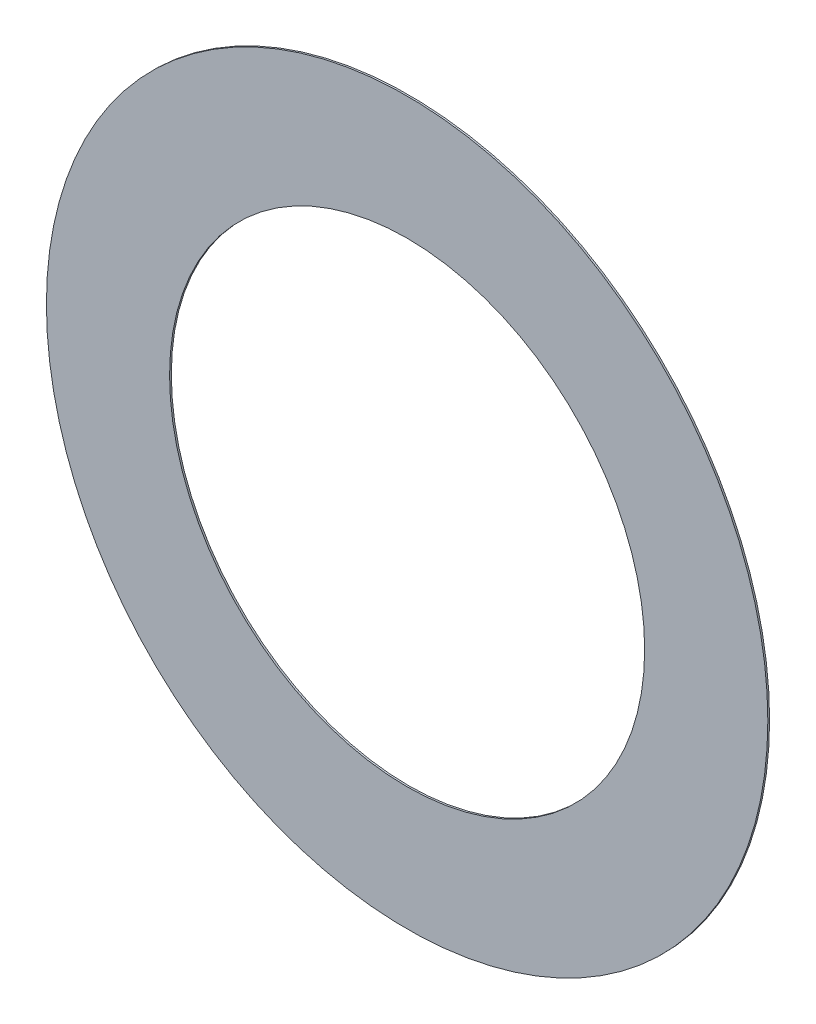
ISO-10303-21;
HEADER;
FILE_DESCRIPTION(('STEP AP214'),'2;1');
FILE_NAME('part.step','',(''),(''),'','','');
FILE_SCHEMA(('AUTOMOTIVE_DESIGN { 1 0 10303 214 1 1 1 1 }'));
ENDSEC;
DATA;
#1=APPLICATION_CONTEXT('core data for automotive mechanical design processes');
#2=APPLICATION_PROTOCOL_DEFINITION('international standard','automotive_design',2000,#1);
#3=PRODUCT_CONTEXT('',#1,'mechanical');
#4=PRODUCT('Part','Part','',(#3));
#5=PRODUCT_RELATED_PRODUCT_CATEGORY('part','',(#4));
#6=PRODUCT_DEFINITION_FORMATION('','',#4);
#7=PRODUCT_DEFINITION_CONTEXT('part definition',#1,'design');
#8=PRODUCT_DEFINITION('design','',#6,#7);
#9=PRODUCT_DEFINITION_SHAPE('','',#8);
#10=(LENGTH_UNIT() NAMED_UNIT(*) SI_UNIT(.MILLI.,.METRE.));
#11=(NAMED_UNIT(*) PLANE_ANGLE_UNIT() SI_UNIT($,.RADIAN.));
#12=(NAMED_UNIT(*) SI_UNIT($,.STERADIAN.) SOLID_ANGLE_UNIT());
#13=UNCERTAINTY_MEASURE_WITH_UNIT(LENGTH_MEASURE(1.E-05),#10,'distance_accuracy_value','');
#14=(GEOMETRIC_REPRESENTATION_CONTEXT(3) GLOBAL_UNCERTAINTY_ASSIGNED_CONTEXT((#13)) GLOBAL_UNIT_ASSIGNED_CONTEXT((#10,
#11,#12)) REPRESENTATION_CONTEXT('',''));
#15=CARTESIAN_POINT('',(0.,0.,0.));
#16=DIRECTION('',(0.,0.,1.));
#17=DIRECTION('',(1.,0.,0.));
#18=AXIS2_PLACEMENT_3D('',#15,#16,#17);
#19=CARTESIAN_POINT('',(0.,0.,0.1));
#20=DIRECTION('',(0.,0.,1.));
#21=DIRECTION('',(1.,0.,0.));
#22=AXIS2_PLACEMENT_3D('',#19,#20,#21);
#23=PLANE('',#22);
#24=CARTESIAN_POINT('',(0.,0.,0.1));
#25=DIRECTION('',(0.,0.,1.));
#26=DIRECTION('',(1.,0.,0.));
#27=AXIS2_PLACEMENT_3D('',#24,#25,#26);
#28=CIRCLE('',#27,20.5);
#29=CARTESIAN_POINT('',(20.5,0.,0.1));
#30=VERTEX_POINT('',#29);
#31=EDGE_CURVE('E10',#30,#30,#28,.T.);
#32=ORIENTED_EDGE('',*,*,#31,.T.);
#33=EDGE_LOOP('',(#32));
#34=FACE_BOUND('',#33,.T.);
#35=CARTESIAN_POINT('',(0.,0.,0.1));
#36=DIRECTION('',(0.,0.,1.));
#37=DIRECTION('',(1.,0.,0.));
#38=AXIS2_PLACEMENT_3D('',#35,#36,#37);
#39=CIRCLE('',#38,13.5);
#40=CARTESIAN_POINT('',(13.5,0.,0.1));
#41=VERTEX_POINT('',#40);
#42=EDGE_CURVE('E42',#41,#41,#39,.T.);
#43=ORIENTED_EDGE('',*,*,#42,.F.);
#44=EDGE_LOOP('',(#43));
#45=FACE_BOUND('',#44,.T.);
#46=ADVANCED_FACE('F31',(#34,#45),#23,.T.);
#47=CARTESIAN_POINT('',(0.,0.,0.));
#48=DIRECTION('',(0.,0.,1.));
#49=DIRECTION('',(1.,0.,0.));
#50=AXIS2_PLACEMENT_3D('',#47,#48,#49);
#51=PLANE('',#50);
#52=CARTESIAN_POINT('',(0.,0.,0.));
#53=DIRECTION('',(0.,0.,1.));
#54=DIRECTION('',(1.,0.,0.));
#55=AXIS2_PLACEMENT_3D('',#52,#53,#54);
#56=CIRCLE('',#55,20.5);
#57=CARTESIAN_POINT('',(20.5,0.,0.));
#58=VERTEX_POINT('',#57);
#59=EDGE_CURVE('E35',#58,#58,#56,.T.);
#60=ORIENTED_EDGE('',*,*,#59,.F.);
#61=EDGE_LOOP('',(#60));
#62=FACE_BOUND('',#61,.T.);
#63=CARTESIAN_POINT('',(0.,0.,0.));
#64=DIRECTION('',(0.,0.,1.));
#65=DIRECTION('',(1.,0.,0.));
#66=AXIS2_PLACEMENT_3D('',#63,#64,#65);
#67=CIRCLE('',#66,13.5);
#68=CARTESIAN_POINT('',(13.5,0.,0.));
#69=VERTEX_POINT('',#68);
#70=EDGE_CURVE('E44',#69,#69,#67,.T.);
#71=ORIENTED_EDGE('',*,*,#70,.T.);
#72=EDGE_LOOP('',(#71));
#73=FACE_BOUND('',#72,.T.);
#74=ADVANCED_FACE('F54',(#62,#73),#51,.F.);
#75=CARTESIAN_POINT('',(0.,0.,0.1));
#76=DIRECTION('',(0.,0.,-1.));
#77=DIRECTION('',(-1.,0.,0.));
#78=AXIS2_PLACEMENT_3D('',#75,#76,#77);
#79=CYLINDRICAL_SURFACE('',#78,20.5);
#80=ORIENTED_EDGE('',*,*,#31,.F.);
#81=EDGE_LOOP('',(#80));
#82=FACE_BOUND('',#81,.T.);
#83=ORIENTED_EDGE('',*,*,#59,.T.);
#84=EDGE_LOOP('',(#83));
#85=FACE_BOUND('',#84,.T.);
#86=ADVANCED_FACE('F33',(#82,#85),#79,.T.);
#87=CARTESIAN_POINT('',(0.,0.,0.1));
#88=DIRECTION('',(0.,0.,-1.));
#89=DIRECTION('',(-1.,0.,0.));
#90=AXIS2_PLACEMENT_3D('',#87,#88,#89);
#91=CYLINDRICAL_SURFACE('',#90,13.5);
#92=ORIENTED_EDGE('',*,*,#42,.T.);
#93=EDGE_LOOP('',(#92));
#94=FACE_BOUND('',#93,.T.);
#95=ORIENTED_EDGE('',*,*,#70,.F.);
#96=EDGE_LOOP('',(#95));
#97=FACE_BOUND('',#96,.T.);
#98=ADVANCED_FACE('F50',(#94,#97),#91,.F.);
#99=CLOSED_SHELL('',(#46,#74,#86,#98));
#100=MANIFOLD_SOLID_BREP('B2',#99);
#101=ADVANCED_BREP_SHAPE_REPRESENTATION('',(#18,#100),#14);
#102=SHAPE_DEFINITION_REPRESENTATION(#9,#101);
ENDSEC;
END-ISO-10303-21;
